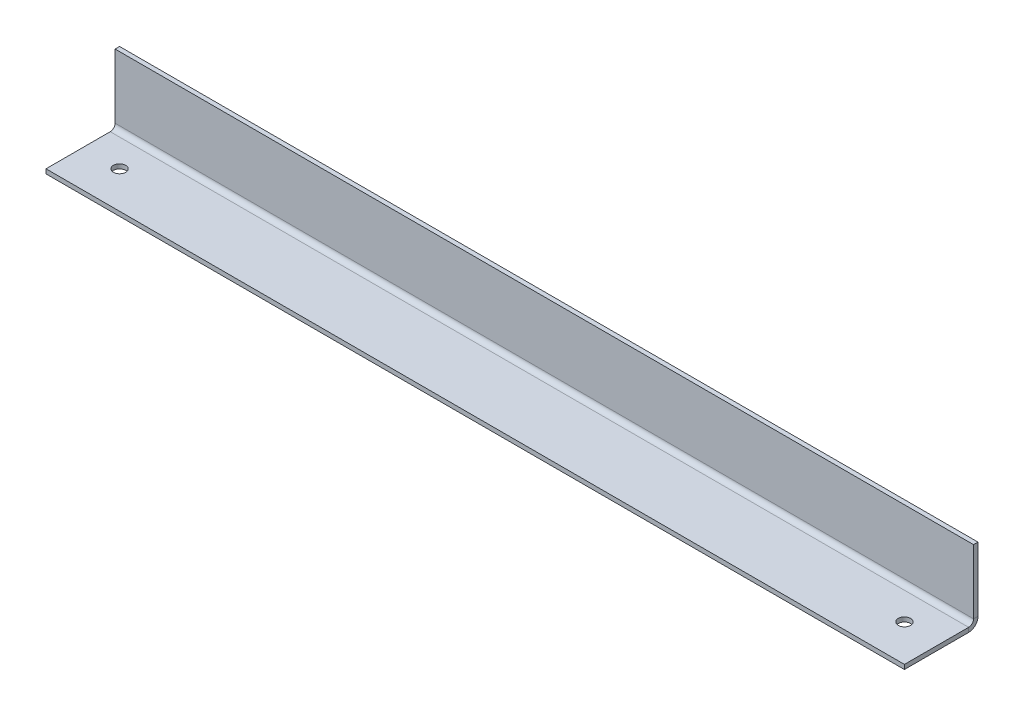
ISO-10303-21;
HEADER;
FILE_DESCRIPTION(('STEP AP214'),'2;1');
FILE_NAME('part.step','',(''),(''),'','','');
FILE_SCHEMA(('AUTOMOTIVE_DESIGN { 1 0 10303 214 1 1 1 1 }'));
ENDSEC;
DATA;
#1=APPLICATION_CONTEXT('core data for automotive mechanical design processes');
#2=APPLICATION_PROTOCOL_DEFINITION('international standard','automotive_design',2000,#1);
#3=PRODUCT_CONTEXT('',#1,'mechanical');
#4=PRODUCT('Part','Part','',(#3));
#5=PRODUCT_RELATED_PRODUCT_CATEGORY('part','',(#4));
#6=PRODUCT_DEFINITION_FORMATION('','',#4);
#7=PRODUCT_DEFINITION_CONTEXT('part definition',#1,'design');
#8=PRODUCT_DEFINITION('design','',#6,#7);
#9=PRODUCT_DEFINITION_SHAPE('','',#8);
#10=(LENGTH_UNIT() NAMED_UNIT(*) SI_UNIT(.MILLI.,.METRE.));
#11=(NAMED_UNIT(*) PLANE_ANGLE_UNIT() SI_UNIT($,.RADIAN.));
#12=(NAMED_UNIT(*) SI_UNIT($,.STERADIAN.) SOLID_ANGLE_UNIT());
#13=UNCERTAINTY_MEASURE_WITH_UNIT(LENGTH_MEASURE(1.E-05),#10,'distance_accuracy_value','');
#14=(GEOMETRIC_REPRESENTATION_CONTEXT(3) GLOBAL_UNCERTAINTY_ASSIGNED_CONTEXT((#13)) GLOBAL_UNIT_ASSIGNED_CONTEXT((#10,
#11,#12)) REPRESENTATION_CONTEXT('',''));
#15=CARTESIAN_POINT('',(0.,0.,0.));
#16=DIRECTION('',(0.,0.,1.));
#17=DIRECTION('',(1.,0.,0.));
#18=AXIS2_PLACEMENT_3D('',#15,#16,#17);
#19=CARTESIAN_POINT('',(0.,-2.304796,0.));
#20=DIRECTION('',(-1.,0.,0.));
#21=DIRECTION('',(0.,0.,1.));
#22=AXIS2_PLACEMENT_3D('',#19,#20,#21);
#23=PLANE('',#22);
#24=DIRECTION('',(0.,0.,1.));
#25=VECTOR('',#24,1.);
#26=CARTESIAN_POINT('',(0.,0.,0.));
#27=LINE('',#26,#25);
#28=CARTESIAN_POINT('',(0.,0.,-33.255204));
#29=VERTEX_POINT('',#28);
#30=CARTESIAN_POINT('',(0.,0.,0.));
#31=VERTEX_POINT('',#30);
#32=EDGE_CURVE('E135',#29,#31,#27,.T.);
#33=ORIENTED_EDGE('',*,*,#32,.F.);
#34=DIRECTION('',(0.,-1.,0.));
#35=VECTOR('',#34,1.);
#36=CARTESIAN_POINT('',(0.,0.,-33.255204));
#37=LINE('',#36,#35);
#38=CARTESIAN_POINT('',(0.,-2.30479600000002,-33.255204));
#39=VERTEX_POINT('',#38);
#40=EDGE_CURVE('E150',#29,#39,#37,.T.);
#41=ORIENTED_EDGE('',*,*,#40,.T.);
#42=DIRECTION('',(0.,0.,1.));
#43=VECTOR('',#42,1.);
#44=CARTESIAN_POINT('',(0.,-2.304796,0.));
#45=LINE('',#44,#43);
#46=CARTESIAN_POINT('',(0.,-2.304796,0.));
#47=VERTEX_POINT('',#46);
#48=EDGE_CURVE('E131',#39,#47,#45,.T.);
#49=ORIENTED_EDGE('',*,*,#48,.T.);
#50=DIRECTION('',(0.,1.,0.));
#51=VECTOR('',#50,1.);
#52=CARTESIAN_POINT('',(0.,-2.304796,0.));
#53=LINE('',#52,#51);
#54=EDGE_CURVE('E75',#47,#31,#53,.T.);
#55=ORIENTED_EDGE('',*,*,#54,.T.);
#56=EDGE_LOOP('',(#33,#41,#49,#55));
#57=FACE_BOUND('',#56,.T.);
#58=ADVANCED_FACE('F72',(#57),#23,.T.);
#59=CARTESIAN_POINT('',(0.,-2.304796,0.));
#60=DIRECTION('',(0.,-1.,0.));
#61=DIRECTION('',(0.,0.,-1.));
#62=AXIS2_PLACEMENT_3D('',#59,#60,#61);
#63=PLANE('',#62);
#64=CARTESIAN_POINT('',(19.05,-2.30479600000002,-19.05));
#65=DIRECTION('',(0.,1.,0.));
#66=DIRECTION('',(0.,0.,1.));
#67=AXIS2_PLACEMENT_3D('',#64,#65,#66);
#68=CIRCLE('',#67,3.175);
#69=CARTESIAN_POINT('',(19.05,-2.30479600000002,-15.875));
#70=VERTEX_POINT('',#69);
#71=EDGE_CURVE('E227',#70,#70,#68,.T.);
#72=ORIENTED_EDGE('',*,*,#71,.T.);
#73=EDGE_LOOP('',(#72));
#74=FACE_BOUND('',#73,.T.);
#75=CARTESIAN_POINT('',(425.45,-2.30479600000002,-19.05));
#76=DIRECTION('',(0.,1.,0.));
#77=DIRECTION('',(0.,0.,1.));
#78=AXIS2_PLACEMENT_3D('',#75,#76,#77);
#79=CIRCLE('',#78,3.17499999999998);
#80=CARTESIAN_POINT('',(425.45,-2.30479600000002,-15.875));
#81=VERTEX_POINT('',#80);
#82=EDGE_CURVE('E181',#81,#81,#79,.T.);
#83=ORIENTED_EDGE('',*,*,#82,.T.);
#84=EDGE_LOOP('',(#83));
#85=FACE_BOUND('',#84,.T.);
#86=ORIENTED_EDGE('',*,*,#48,.F.);
#87=DIRECTION('',(-1.,0.,0.));
#88=VECTOR('',#87,1.);
#89=CARTESIAN_POINT('',(0.,-2.30479600000002,-33.255204));
#90=LINE('',#89,#88);
#91=CARTESIAN_POINT('',(444.5,-2.304796,-33.255204));
#92=VERTEX_POINT('',#91);
#93=EDGE_CURVE('E171',#39,#92,#90,.F.);
#94=ORIENTED_EDGE('',*,*,#93,.T.);
#95=DIRECTION('',(0.,0.,-1.));
#96=VECTOR('',#95,1.);
#97=CARTESIAN_POINT('',(444.5,-2.304796,0.));
#98=LINE('',#97,#96);
#99=CARTESIAN_POINT('',(444.5,-2.304796,0.));
#100=VERTEX_POINT('',#99);
#101=EDGE_CURVE('E145',#100,#92,#98,.T.);
#102=ORIENTED_EDGE('',*,*,#101,.F.);
#103=DIRECTION('',(1.,0.,0.));
#104=VECTOR('',#103,1.);
#105=CARTESIAN_POINT('',(0.,-2.304796,0.));
#106=LINE('',#105,#104);
#107=EDGE_CURVE('E121',#47,#100,#106,.T.);
#108=ORIENTED_EDGE('',*,*,#107,.F.);
#109=EDGE_LOOP('',(#86,#94,#102,#108));
#110=FACE_BOUND('',#109,.T.);
#111=ADVANCED_FACE('F241',(#74,#85,#110),#63,.T.);
#112=CARTESIAN_POINT('',(0.,0.,0.));
#113=DIRECTION('',(0.,-1.,0.));
#114=DIRECTION('',(0.,0.,-1.));
#115=AXIS2_PLACEMENT_3D('',#112,#113,#114);
#116=PLANE('',#115);
#117=CARTESIAN_POINT('',(19.05,0.,-19.05));
#118=DIRECTION('',(0.,1.,0.));
#119=DIRECTION('',(0.,0.,1.));
#120=AXIS2_PLACEMENT_3D('',#117,#118,#119);
#121=CIRCLE('',#120,3.175);
#122=CARTESIAN_POINT('',(19.05,0.,-15.875));
#123=VERTEX_POINT('',#122);
#124=EDGE_CURVE('E231',#123,#123,#121,.T.);
#125=ORIENTED_EDGE('',*,*,#124,.F.);
#126=EDGE_LOOP('',(#125));
#127=FACE_BOUND('',#126,.T.);
#128=CARTESIAN_POINT('',(425.45,0.,-19.05));
#129=DIRECTION('',(0.,1.,0.));
#130=DIRECTION('',(0.,0.,1.));
#131=AXIS2_PLACEMENT_3D('',#128,#129,#130);
#132=CIRCLE('',#131,3.17499999999998);
#133=CARTESIAN_POINT('',(425.45,0.,-15.875));
#134=VERTEX_POINT('',#133);
#135=EDGE_CURVE('E223',#134,#134,#132,.T.);
#136=ORIENTED_EDGE('',*,*,#135,.F.);
#137=EDGE_LOOP('',(#136));
#138=FACE_BOUND('',#137,.T.);
#139=DIRECTION('',(-1.,0.,0.));
#140=VECTOR('',#139,1.);
#141=CARTESIAN_POINT('',(0.,0.,-33.255204));
#142=LINE('',#141,#140);
#143=CARTESIAN_POINT('',(444.5,0.,-33.255204));
#144=VERTEX_POINT('',#143);
#145=EDGE_CURVE('E158',#29,#144,#142,.F.);
#146=ORIENTED_EDGE('',*,*,#145,.F.);
#147=ORIENTED_EDGE('',*,*,#32,.T.);
#148=DIRECTION('',(1.,0.,0.));
#149=VECTOR('',#148,1.);
#150=CARTESIAN_POINT('',(0.,0.,0.));
#151=LINE('',#150,#149);
#152=CARTESIAN_POINT('',(444.5,0.,0.));
#153=VERTEX_POINT('',#152);
#154=EDGE_CURVE('E119',#31,#153,#151,.T.);
#155=ORIENTED_EDGE('',*,*,#154,.T.);
#156=DIRECTION('',(0.,0.,-1.));
#157=VECTOR('',#156,1.);
#158=CARTESIAN_POINT('',(444.5,0.,0.));
#159=LINE('',#158,#157);
#160=EDGE_CURVE('E124',#153,#144,#159,.T.);
#161=ORIENTED_EDGE('',*,*,#160,.T.);
#162=EDGE_LOOP('',(#146,#147,#155,#161));
#163=FACE_BOUND('',#162,.T.);
#164=ADVANCED_FACE('F133',(#127,#138,#163),#116,.F.);
#165=CARTESIAN_POINT('',(444.5,-2.304796,0.));
#166=DIRECTION('',(1.,0.,0.));
#167=DIRECTION('',(0.,0.,-1.));
#168=AXIS2_PLACEMENT_3D('',#165,#166,#167);
#169=PLANE('',#168);
#170=DIRECTION('',(0.,-1.,0.));
#171=VECTOR('',#170,1.);
#172=CARTESIAN_POINT('',(444.5,0.,-33.255204));
#173=LINE('',#172,#171);
#174=EDGE_CURVE('E127',#144,#92,#173,.T.);
#175=ORIENTED_EDGE('',*,*,#174,.F.);
#176=ORIENTED_EDGE('',*,*,#160,.F.);
#177=DIRECTION('',(0.,1.,0.));
#178=VECTOR('',#177,1.);
#179=CARTESIAN_POINT('',(444.5,-2.304796,0.));
#180=LINE('',#179,#178);
#181=EDGE_CURVE('E13',#100,#153,#180,.T.);
#182=ORIENTED_EDGE('',*,*,#181,.F.);
#183=ORIENTED_EDGE('',*,*,#101,.T.);
#184=EDGE_LOOP('',(#175,#176,#182,#183));
#185=FACE_BOUND('',#184,.T.);
#186=ADVANCED_FACE('F125',(#185),#169,.T.);
#187=CARTESIAN_POINT('',(0.,-2.304796,0.));
#188=DIRECTION('',(0.,0.,1.));
#189=DIRECTION('',(1.,0.,0.));
#190=AXIS2_PLACEMENT_3D('',#187,#188,#189);
#191=PLANE('',#190);
#192=ORIENTED_EDGE('',*,*,#154,.F.);
#193=ORIENTED_EDGE('',*,*,#54,.F.);
#194=ORIENTED_EDGE('',*,*,#107,.T.);
#195=ORIENTED_EDGE('',*,*,#181,.T.);
#196=EDGE_LOOP('',(#192,#193,#194,#195));
#197=FACE_BOUND('',#196,.T.);
#198=ADVANCED_FACE('F116',(#197),#191,.T.);
#199=CARTESIAN_POINT('',(444.5,2.53999999999998,-33.255204));
#200=DIRECTION('',(1.,0.,0.));
#201=DIRECTION('',(0.,0.,-1.));
#202=AXIS2_PLACEMENT_3D('',#199,#200,#201);
#203=PLANE('',#202);
#204=DIRECTION('',(0.,0.,1.));
#205=VECTOR('',#204,1.);
#206=CARTESIAN_POINT('',(444.5,2.54000000000001,-38.1));
#207=LINE('',#206,#205);
#208=CARTESIAN_POINT('',(444.5,2.53999999999997,-35.795204));
#209=VERTEX_POINT('',#208);
#210=CARTESIAN_POINT('',(444.5,2.53999999999996,-38.1));
#211=VERTEX_POINT('',#210);
#212=EDGE_CURVE('E177',#209,#211,#207,.F.);
#213=ORIENTED_EDGE('',*,*,#212,.F.);
#214=CARTESIAN_POINT('',(444.5,2.53999999999998,-33.255204));
#215=DIRECTION('',(-1.,0.,0.));
#216=DIRECTION('',(0.,0.,1.));
#217=AXIS2_PLACEMENT_3D('',#214,#215,#216);
#218=CIRCLE('',#217,2.54);
#219=EDGE_CURVE('E163',#144,#209,#218,.F.);
#220=ORIENTED_EDGE('',*,*,#219,.F.);
#221=ORIENTED_EDGE('',*,*,#174,.T.);
#222=CARTESIAN_POINT('',(444.5,2.53999999999998,-33.255204));
#223=DIRECTION('',(-1.,0.,0.));
#224=DIRECTION('',(0.,0.,1.));
#225=AXIS2_PLACEMENT_3D('',#222,#223,#224);
#226=CIRCLE('',#225,4.844796);
#227=EDGE_CURVE('E90',#92,#211,#226,.F.);
#228=ORIENTED_EDGE('',*,*,#227,.T.);
#229=EDGE_LOOP('',(#213,#220,#221,#228));
#230=FACE_BOUND('',#229,.T.);
#231=ADVANCED_FACE('F333',(#230),#203,.T.);
#232=CARTESIAN_POINT('',(0.,2.53999999999998,-33.255204));
#233=DIRECTION('',(1.,0.,0.));
#234=DIRECTION('',(0.,0.,-1.));
#235=AXIS2_PLACEMENT_3D('',#232,#233,#234);
#236=PLANE('',#235);
#237=CARTESIAN_POINT('',(0.,2.53999999999998,-33.255204));
#238=DIRECTION('',(-1.,0.,0.));
#239=DIRECTION('',(0.,0.,1.));
#240=AXIS2_PLACEMENT_3D('',#237,#238,#239);
#241=CIRCLE('',#240,2.54);
#242=CARTESIAN_POINT('',(0.,2.53999999999997,-35.795204));
#243=VERTEX_POINT('',#242);
#244=EDGE_CURVE('E154',#243,#29,#241,.T.);
#245=ORIENTED_EDGE('',*,*,#244,.F.);
#246=DIRECTION('',(0.,0.,1.));
#247=VECTOR('',#246,1.);
#248=CARTESIAN_POINT('',(0.,2.54,-35.795204));
#249=LINE('',#248,#247);
#250=CARTESIAN_POINT('',(0.,2.54000000000002,-38.1));
#251=VERTEX_POINT('',#250);
#252=EDGE_CURVE('E185',#243,#251,#249,.F.);
#253=ORIENTED_EDGE('',*,*,#252,.T.);
#254=CARTESIAN_POINT('',(0.,2.53999999999998,-33.255204));
#255=DIRECTION('',(-1.,0.,0.));
#256=DIRECTION('',(0.,0.,1.));
#257=AXIS2_PLACEMENT_3D('',#254,#255,#256);
#258=CIRCLE('',#257,4.844796);
#259=EDGE_CURVE('E167',#251,#39,#258,.T.);
#260=ORIENTED_EDGE('',*,*,#259,.T.);
#261=ORIENTED_EDGE('',*,*,#40,.F.);
#262=EDGE_LOOP('',(#245,#253,#260,#261));
#263=FACE_BOUND('',#262,.T.);
#264=ADVANCED_FACE('F315',(#263),#236,.F.);
#265=CARTESIAN_POINT('',(0.,2.53999999999998,-33.255204));
#266=DIRECTION('',(-1.,0.,0.));
#267=DIRECTION('',(0.,0.,-1.));
#268=AXIS2_PLACEMENT_3D('',#265,#266,#267);
#269=CYLINDRICAL_SURFACE('',#268,4.844796);
#270=ORIENTED_EDGE('',*,*,#93,.F.);
#271=ORIENTED_EDGE('',*,*,#259,.F.);
#272=DIRECTION('',(-1.,0.,0.));
#273=VECTOR('',#272,1.);
#274=CARTESIAN_POINT('',(444.5,2.54000000000001,-38.1));
#275=LINE('',#274,#273);
#276=EDGE_CURVE('E188',#251,#211,#275,.F.);
#277=ORIENTED_EDGE('',*,*,#276,.T.);
#278=ORIENTED_EDGE('',*,*,#227,.F.);
#279=EDGE_LOOP('',(#270,#271,#277,#278));
#280=FACE_BOUND('',#279,.T.);
#281=ADVANCED_FACE('F313',(#280),#269,.T.);
#282=CARTESIAN_POINT('',(0.,2.53999999999998,-33.255204));
#283=DIRECTION('',(-1.,0.,0.));
#284=DIRECTION('',(0.,0.,-1.));
#285=AXIS2_PLACEMENT_3D('',#282,#283,#284);
#286=CYLINDRICAL_SURFACE('',#285,2.54);
#287=ORIENTED_EDGE('',*,*,#145,.T.);
#288=ORIENTED_EDGE('',*,*,#219,.T.);
#289=DIRECTION('',(-1.,0.,0.));
#290=VECTOR('',#289,1.);
#291=CARTESIAN_POINT('',(444.5,2.53999999999999,-35.795204));
#292=LINE('',#291,#290);
#293=EDGE_CURVE('E180',#209,#243,#292,.T.);
#294=ORIENTED_EDGE('',*,*,#293,.T.);
#295=ORIENTED_EDGE('',*,*,#244,.T.);
#296=EDGE_LOOP('',(#287,#288,#294,#295));
#297=FACE_BOUND('',#296,.T.);
#298=ADVANCED_FACE('F332',(#297),#286,.F.);
#299=CARTESIAN_POINT('',(444.5,0.,-38.1));
#300=DIRECTION('',(-1.,0.,0.));
#301=DIRECTION('',(0.,0.,1.));
#302=AXIS2_PLACEMENT_3D('',#299,#300,#301);
#303=PLANE('',#302);
#304=ORIENTED_EDGE('',*,*,#212,.T.);
#305=DIRECTION('',(0.,-1.,0.));
#306=VECTOR('',#305,1.);
#307=CARTESIAN_POINT('',(444.5,-1.40989359769286E-13,-38.1));
#308=LINE('',#307,#306);
#309=CARTESIAN_POINT('',(444.5,35.795204,-38.1000000000001));
#310=VERTEX_POINT('',#309);
#311=EDGE_CURVE('E203',#310,#211,#308,.T.);
#312=ORIENTED_EDGE('',*,*,#311,.F.);
#313=DIRECTION('',(0.,0.,1.));
#314=VECTOR('',#313,1.);
#315=CARTESIAN_POINT('',(444.5,35.795204,-38.1000000000001));
#316=LINE('',#315,#314);
#317=CARTESIAN_POINT('',(444.5,35.795204,-35.7952040000001));
#318=VERTEX_POINT('',#317);
#319=EDGE_CURVE('E215',#310,#318,#316,.T.);
#320=ORIENTED_EDGE('',*,*,#319,.T.);
#321=DIRECTION('',(0.,1.,0.));
#322=VECTOR('',#321,1.);
#323=CARTESIAN_POINT('',(444.5,0.,-35.795204));
#324=LINE('',#323,#322);
#325=EDGE_CURVE('E191',#318,#209,#324,.F.);
#326=ORIENTED_EDGE('',*,*,#325,.T.);
#327=EDGE_LOOP('',(#304,#312,#320,#326));
#328=FACE_BOUND('',#327,.T.);
#329=ADVANCED_FACE('F328',(#328),#303,.F.);
#330=CARTESIAN_POINT('',(0.,35.795204,-38.1000000000001));
#331=DIRECTION('',(1.,0.,0.));
#332=DIRECTION('',(0.,0.,-1.));
#333=AXIS2_PLACEMENT_3D('',#330,#331,#332);
#334=PLANE('',#333);
#335=ORIENTED_EDGE('',*,*,#252,.F.);
#336=DIRECTION('',(0.,-1.,0.));
#337=VECTOR('',#336,1.);
#338=CARTESIAN_POINT('',(0.,35.795204,-35.7952040000001));
#339=LINE('',#338,#337);
#340=CARTESIAN_POINT('',(0.,35.795204,-35.7952040000001));
#341=VERTEX_POINT('',#340);
#342=EDGE_CURVE('E195',#243,#341,#339,.F.);
#343=ORIENTED_EDGE('',*,*,#342,.T.);
#344=DIRECTION('',(0.,0.,1.));
#345=VECTOR('',#344,1.);
#346=CARTESIAN_POINT('',(0.,35.795204,-38.1000000000001));
#347=LINE('',#346,#345);
#348=CARTESIAN_POINT('',(0.,35.795204,-38.1000000000001));
#349=VERTEX_POINT('',#348);
#350=EDGE_CURVE('E159',#349,#341,#347,.T.);
#351=ORIENTED_EDGE('',*,*,#350,.F.);
#352=DIRECTION('',(0.,1.,0.));
#353=VECTOR('',#352,1.);
#354=CARTESIAN_POINT('',(0.,-1.40989359769286E-13,-38.1));
#355=LINE('',#354,#353);
#356=EDGE_CURVE('E207',#251,#349,#355,.T.);
#357=ORIENTED_EDGE('',*,*,#356,.F.);
#358=EDGE_LOOP('',(#335,#343,#351,#357));
#359=FACE_BOUND('',#358,.T.);
#360=ADVANCED_FACE('F324',(#359),#334,.F.);
#361=CARTESIAN_POINT('',(0.,-1.40989359769286E-13,-38.1));
#362=DIRECTION('',(0.,0.,1.));
#363=DIRECTION('',(0.,-1.,0.));
#364=AXIS2_PLACEMENT_3D('',#361,#362,#363);
#365=PLANE('',#364);
#366=ORIENTED_EDGE('',*,*,#276,.F.);
#367=ORIENTED_EDGE('',*,*,#356,.T.);
#368=DIRECTION('',(1.,0.,0.));
#369=VECTOR('',#368,1.);
#370=CARTESIAN_POINT('',(0.,35.795204,-38.1000000000001));
#371=LINE('',#370,#369);
#372=EDGE_CURVE('E211',#349,#310,#371,.T.);
#373=ORIENTED_EDGE('',*,*,#372,.T.);
#374=ORIENTED_EDGE('',*,*,#311,.T.);
#375=EDGE_LOOP('',(#366,#367,#373,#374));
#376=FACE_BOUND('',#375,.T.);
#377=ADVANCED_FACE('F321',(#376),#365,.F.);
#378=CARTESIAN_POINT('',(0.,-1.32942207545446E-13,-35.795204));
#379=DIRECTION('',(0.,0.,1.));
#380=DIRECTION('',(0.,-1.,0.));
#381=AXIS2_PLACEMENT_3D('',#378,#379,#380);
#382=PLANE('',#381);
#383=ORIENTED_EDGE('',*,*,#342,.F.);
#384=ORIENTED_EDGE('',*,*,#293,.F.);
#385=ORIENTED_EDGE('',*,*,#325,.F.);
#386=DIRECTION('',(-1.,0.,0.));
#387=VECTOR('',#386,1.);
#388=CARTESIAN_POINT('',(444.5,35.795204,-35.7952040000001));
#389=LINE('',#388,#387);
#390=EDGE_CURVE('E199',#341,#318,#389,.F.);
#391=ORIENTED_EDGE('',*,*,#390,.F.);
#392=EDGE_LOOP('',(#383,#384,#385,#391));
#393=FACE_BOUND('',#392,.T.);
#394=ADVANCED_FACE('F256',(#393),#382,.T.);
#395=CARTESIAN_POINT('',(444.5,35.795204,-38.1000000000001));
#396=DIRECTION('',(0.,-1.,0.));
#397=DIRECTION('',(0.,0.,-1.));
#398=AXIS2_PLACEMENT_3D('',#395,#396,#397);
#399=PLANE('',#398);
#400=ORIENTED_EDGE('',*,*,#390,.T.);
#401=ORIENTED_EDGE('',*,*,#319,.F.);
#402=ORIENTED_EDGE('',*,*,#372,.F.);
#403=ORIENTED_EDGE('',*,*,#350,.T.);
#404=EDGE_LOOP('',(#400,#401,#402,#403));
#405=FACE_BOUND('',#404,.T.);
#406=ADVANCED_FACE('F247',(#405),#399,.F.);
#407=CARTESIAN_POINT('',(425.45,0.,-19.05));
#408=DIRECTION('',(0.,1.,0.));
#409=DIRECTION('',(0.,0.,1.));
#410=AXIS2_PLACEMENT_3D('',#407,#408,#409);
#411=CYLINDRICAL_SURFACE('',#410,3.17499999999998);
#412=ORIENTED_EDGE('',*,*,#82,.F.);
#413=EDGE_LOOP('',(#412));
#414=FACE_BOUND('',#413,.T.);
#415=ORIENTED_EDGE('',*,*,#135,.T.);
#416=EDGE_LOOP('',(#415));
#417=FACE_BOUND('',#416,.T.);
#418=ADVANCED_FACE('F245',(#414,#417),#411,.F.);
#419=CARTESIAN_POINT('',(19.05,0.,-19.05));
#420=DIRECTION('',(0.,1.,0.));
#421=DIRECTION('',(0.,0.,1.));
#422=AXIS2_PLACEMENT_3D('',#419,#420,#421);
#423=CYLINDRICAL_SURFACE('',#422,3.175);
#424=ORIENTED_EDGE('',*,*,#71,.F.);
#425=EDGE_LOOP('',(#424));
#426=FACE_BOUND('',#425,.T.);
#427=ORIENTED_EDGE('',*,*,#124,.T.);
#428=EDGE_LOOP('',(#427));
#429=FACE_BOUND('',#428,.T.);
#430=ADVANCED_FACE('F237',(#426,#429),#423,.F.);
#431=CLOSED_SHELL('',(#58,#111,#164,#186,#198,#231,#264,#281,#298,#329,#360,#377,#394,#406,#418,#430));
#432=MANIFOLD_SOLID_BREP('B2',#431);
#433=ADVANCED_BREP_SHAPE_REPRESENTATION('',(#18,#432),#14);
#434=SHAPE_DEFINITION_REPRESENTATION(#9,#433);
ENDSEC;
END-ISO-10303-21;
